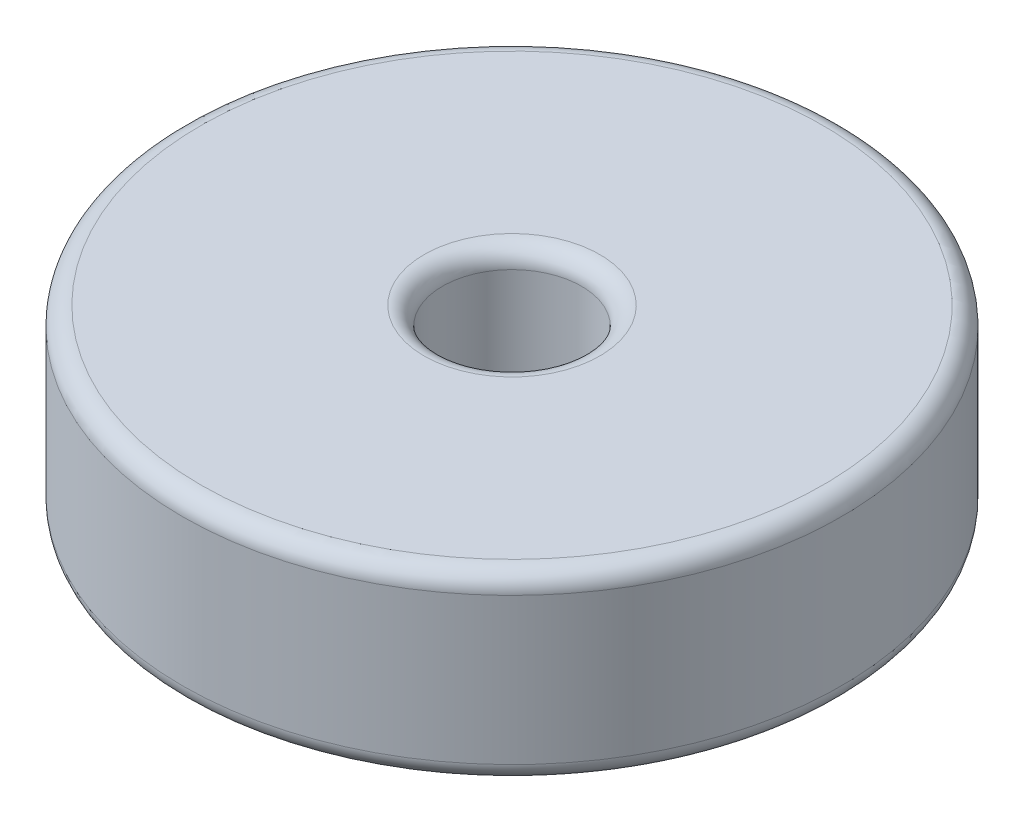
ISO-10303-21;
HEADER;
FILE_DESCRIPTION(('STEP AP214'),'2;1');
FILE_NAME('part.step','',(''),(''),'','','');
FILE_SCHEMA(('AUTOMOTIVE_DESIGN { 1 0 10303 214 1 1 1 1 }'));
ENDSEC;
DATA;
#1=APPLICATION_CONTEXT('core data for automotive mechanical design processes');
#2=APPLICATION_PROTOCOL_DEFINITION('international standard','automotive_design',2000,#1);
#3=PRODUCT_CONTEXT('',#1,'mechanical');
#4=PRODUCT('Part','Part','',(#3));
#5=PRODUCT_RELATED_PRODUCT_CATEGORY('part','',(#4));
#6=PRODUCT_DEFINITION_FORMATION('','',#4);
#7=PRODUCT_DEFINITION_CONTEXT('part definition',#1,'design');
#8=PRODUCT_DEFINITION('design','',#6,#7);
#9=PRODUCT_DEFINITION_SHAPE('','',#8);
#10=(LENGTH_UNIT() NAMED_UNIT(*) SI_UNIT(.MILLI.,.METRE.));
#11=(NAMED_UNIT(*) PLANE_ANGLE_UNIT() SI_UNIT($,.RADIAN.));
#12=(NAMED_UNIT(*) SI_UNIT($,.STERADIAN.) SOLID_ANGLE_UNIT());
#13=UNCERTAINTY_MEASURE_WITH_UNIT(LENGTH_MEASURE(1.E-05),#10,'distance_accuracy_value','');
#14=(GEOMETRIC_REPRESENTATION_CONTEXT(3) GLOBAL_UNCERTAINTY_ASSIGNED_CONTEXT((#13)) GLOBAL_UNIT_ASSIGNED_CONTEXT((#10,
#11,#12)) REPRESENTATION_CONTEXT('',''));
#15=CARTESIAN_POINT('',(0.,0.,0.));
#16=DIRECTION('',(0.,0.,1.));
#17=DIRECTION('',(1.,0.,0.));
#18=AXIS2_PLACEMENT_3D('',#15,#16,#17);
#19=CARTESIAN_POINT('',(0.,3.175,0.));
#20=DIRECTION('',(0.,1.,0.));
#21=DIRECTION('',(0.,0.,1.));
#22=AXIS2_PLACEMENT_3D('',#19,#20,#21);
#23=PLANE('',#22);
#24=CARTESIAN_POINT('',(0.,3.175,0.));
#25=DIRECTION('',(0.,1.,0.));
#26=DIRECTION('',(0.,0.,1.));
#27=AXIS2_PLACEMENT_3D('',#24,#25,#26);
#28=CIRCLE('',#27,3.048);
#29=CARTESIAN_POINT('',(0.,3.175,3.048));
#30=VERTEX_POINT('',#29);
#31=EDGE_CURVE('E10',#30,#30,#28,.F.);
#32=ORIENTED_EDGE('',*,*,#31,.T.);
#33=EDGE_LOOP('',(#32));
#34=FACE_BOUND('',#33,.T.);
#35=CARTESIAN_POINT('',(0.,3.175,0.));
#36=DIRECTION('',(0.,1.,0.));
#37=DIRECTION('',(0.,0.,1.));
#38=AXIS2_PLACEMENT_3D('',#35,#36,#37);
#39=CIRCLE('',#38,10.795);
#40=CARTESIAN_POINT('',(0.,3.175,10.795));
#41=VERTEX_POINT('',#40);
#42=EDGE_CURVE('E49',#41,#41,#39,.T.);
#43=ORIENTED_EDGE('',*,*,#42,.T.);
#44=EDGE_LOOP('',(#43));
#45=FACE_BOUND('',#44,.T.);
#46=ADVANCED_FACE('F41',(#34,#45),#23,.T.);
#47=CARTESIAN_POINT('',(0.,-3.175,0.));
#48=DIRECTION('',(0.,1.,0.));
#49=DIRECTION('',(0.,0.,1.));
#50=AXIS2_PLACEMENT_3D('',#47,#48,#49);
#51=PLANE('',#50);
#52=CARTESIAN_POINT('',(0.,-3.175,0.));
#53=DIRECTION('',(0.,1.,0.));
#54=DIRECTION('',(0.,0.,1.));
#55=AXIS2_PLACEMENT_3D('',#52,#53,#54);
#56=CIRCLE('',#55,3.048);
#57=CARTESIAN_POINT('',(0.,-3.175,3.048));
#58=VERTEX_POINT('',#57);
#59=EDGE_CURVE('E73',#58,#58,#56,.T.);
#60=ORIENTED_EDGE('',*,*,#59,.T.);
#61=EDGE_LOOP('',(#60));
#62=FACE_BOUND('',#61,.T.);
#63=CARTESIAN_POINT('',(0.,-3.175,0.));
#64=DIRECTION('',(0.,1.,0.));
#65=DIRECTION('',(0.,0.,1.));
#66=AXIS2_PLACEMENT_3D('',#63,#64,#65);
#67=CIRCLE('',#66,10.795);
#68=CARTESIAN_POINT('',(0.,-3.175,10.795));
#69=VERTEX_POINT('',#68);
#70=EDGE_CURVE('E77',#69,#69,#67,.F.);
#71=ORIENTED_EDGE('',*,*,#70,.T.);
#72=EDGE_LOOP('',(#71));
#73=FACE_BOUND('',#72,.T.);
#74=ADVANCED_FACE('F82',(#62,#73),#51,.F.);
#75=CARTESIAN_POINT('',(0.,3.175,0.));
#76=DIRECTION('',(0.,-1.,0.));
#77=DIRECTION('',(0.,0.,-1.));
#78=AXIS2_PLACEMENT_3D('',#75,#76,#77);
#79=CYLINDRICAL_SURFACE('',#78,11.43);
#80=CARTESIAN_POINT('',(0.,-2.54,0.));
#81=DIRECTION('',(0.,1.,0.));
#82=DIRECTION('',(0.,0.,1.));
#83=AXIS2_PLACEMENT_3D('',#80,#81,#82);
#84=CIRCLE('',#83,11.43);
#85=CARTESIAN_POINT('',(0.,-2.54,11.43));
#86=VERTEX_POINT('',#85);
#87=EDGE_CURVE('E54',#86,#86,#84,.T.);
#88=ORIENTED_EDGE('',*,*,#87,.T.);
#89=EDGE_LOOP('',(#88));
#90=FACE_BOUND('',#89,.T.);
#91=CARTESIAN_POINT('',(0.,2.54,0.));
#92=DIRECTION('',(0.,1.,0.));
#93=DIRECTION('',(0.,0.,1.));
#94=AXIS2_PLACEMENT_3D('',#91,#92,#93);
#95=CIRCLE('',#94,11.43);
#96=CARTESIAN_POINT('',(0.,2.54,11.43));
#97=VERTEX_POINT('',#96);
#98=EDGE_CURVE('E59',#97,#97,#95,.F.);
#99=ORIENTED_EDGE('',*,*,#98,.T.);
#100=EDGE_LOOP('',(#99));
#101=FACE_BOUND('',#100,.T.);
#102=ADVANCED_FACE('F92',(#90,#101),#79,.T.);
#103=CARTESIAN_POINT('',(0.,3.175,0.));
#104=DIRECTION('',(0.,-1.,0.));
#105=DIRECTION('',(0.,0.,-1.));
#106=AXIS2_PLACEMENT_3D('',#103,#104,#105);
#107=CYLINDRICAL_SURFACE('',#106,2.413);
#108=CARTESIAN_POINT('',(0.,-2.54,0.));
#109=DIRECTION('',(0.,1.,0.));
#110=DIRECTION('',(0.,0.,1.));
#111=AXIS2_PLACEMENT_3D('',#108,#109,#110);
#112=CIRCLE('',#111,2.413);
#113=CARTESIAN_POINT('',(0.,-2.54,2.413));
#114=VERTEX_POINT('',#113);
#115=EDGE_CURVE('E65',#114,#114,#112,.F.);
#116=ORIENTED_EDGE('',*,*,#115,.T.);
#117=EDGE_LOOP('',(#116));
#118=FACE_BOUND('',#117,.T.);
#119=CARTESIAN_POINT('',(0.,2.54,0.));
#120=DIRECTION('',(0.,1.,0.));
#121=DIRECTION('',(0.,0.,1.));
#122=AXIS2_PLACEMENT_3D('',#119,#120,#121);
#123=CIRCLE('',#122,2.413);
#124=CARTESIAN_POINT('',(0.,2.54,2.413));
#125=VERTEX_POINT('',#124);
#126=EDGE_CURVE('E69',#125,#125,#123,.T.);
#127=ORIENTED_EDGE('',*,*,#126,.T.);
#128=EDGE_LOOP('',(#127));
#129=FACE_BOUND('',#128,.T.);
#130=ADVANCED_FACE('F95',(#118,#129),#107,.F.);
#131=CARTESIAN_POINT('',(0.,-2.54,0.));
#132=DIRECTION('',(0.,1.,0.));
#133=DIRECTION('',(0.,0.,1.));
#134=AXIS2_PLACEMENT_3D('',#131,#132,#133);
#135=TOROIDAL_SURFACE('',#134,3.048,0.635);
#136=ORIENTED_EDGE('',*,*,#115,.F.);
#137=EDGE_LOOP('',(#136));
#138=FACE_BOUND('',#137,.T.);
#139=ORIENTED_EDGE('',*,*,#59,.F.);
#140=EDGE_LOOP('',(#139));
#141=FACE_BOUND('',#140,.T.);
#142=ADVANCED_FACE('F88',(#138,#141),#135,.T.);
#143=CARTESIAN_POINT('',(0.,-2.54,0.));
#144=DIRECTION('',(0.,1.,0.));
#145=DIRECTION('',(0.,0.,1.));
#146=AXIS2_PLACEMENT_3D('',#143,#144,#145);
#147=TOROIDAL_SURFACE('',#146,10.795,0.635);
#148=ORIENTED_EDGE('',*,*,#70,.F.);
#149=EDGE_LOOP('',(#148));
#150=FACE_BOUND('',#149,.T.);
#151=ORIENTED_EDGE('',*,*,#87,.F.);
#152=EDGE_LOOP('',(#151));
#153=FACE_BOUND('',#152,.T.);
#154=ADVANCED_FACE('F84',(#150,#153),#147,.T.);
#155=CARTESIAN_POINT('',(0.,2.54,0.));
#156=DIRECTION('',(0.,1.,0.));
#157=DIRECTION('',(0.,0.,1.));
#158=AXIS2_PLACEMENT_3D('',#155,#156,#157);
#159=TOROIDAL_SURFACE('',#158,3.048,0.635);
#160=ORIENTED_EDGE('',*,*,#31,.F.);
#161=EDGE_LOOP('',(#160));
#162=FACE_BOUND('',#161,.T.);
#163=ORIENTED_EDGE('',*,*,#126,.F.);
#164=EDGE_LOOP('',(#163));
#165=FACE_BOUND('',#164,.T.);
#166=ADVANCED_FACE('F87',(#162,#165),#159,.T.);
#167=CARTESIAN_POINT('',(0.,2.54,0.));
#168=DIRECTION('',(0.,1.,0.));
#169=DIRECTION('',(0.,0.,1.));
#170=AXIS2_PLACEMENT_3D('',#167,#168,#169);
#171=TOROIDAL_SURFACE('',#170,10.795,0.635);
#172=ORIENTED_EDGE('',*,*,#98,.F.);
#173=EDGE_LOOP('',(#172));
#174=FACE_BOUND('',#173,.T.);
#175=ORIENTED_EDGE('',*,*,#42,.F.);
#176=EDGE_LOOP('',(#175));
#177=FACE_BOUND('',#176,.T.);
#178=ADVANCED_FACE('F43',(#174,#177),#171,.T.);
#179=CLOSED_SHELL('',(#46,#74,#102,#130,#142,#154,#166,#178));
#180=MANIFOLD_SOLID_BREP('B2',#179);
#181=ADVANCED_BREP_SHAPE_REPRESENTATION('',(#18,#180),#14);
#182=SHAPE_DEFINITION_REPRESENTATION(#9,#181);
ENDSEC;
END-ISO-10303-21;
